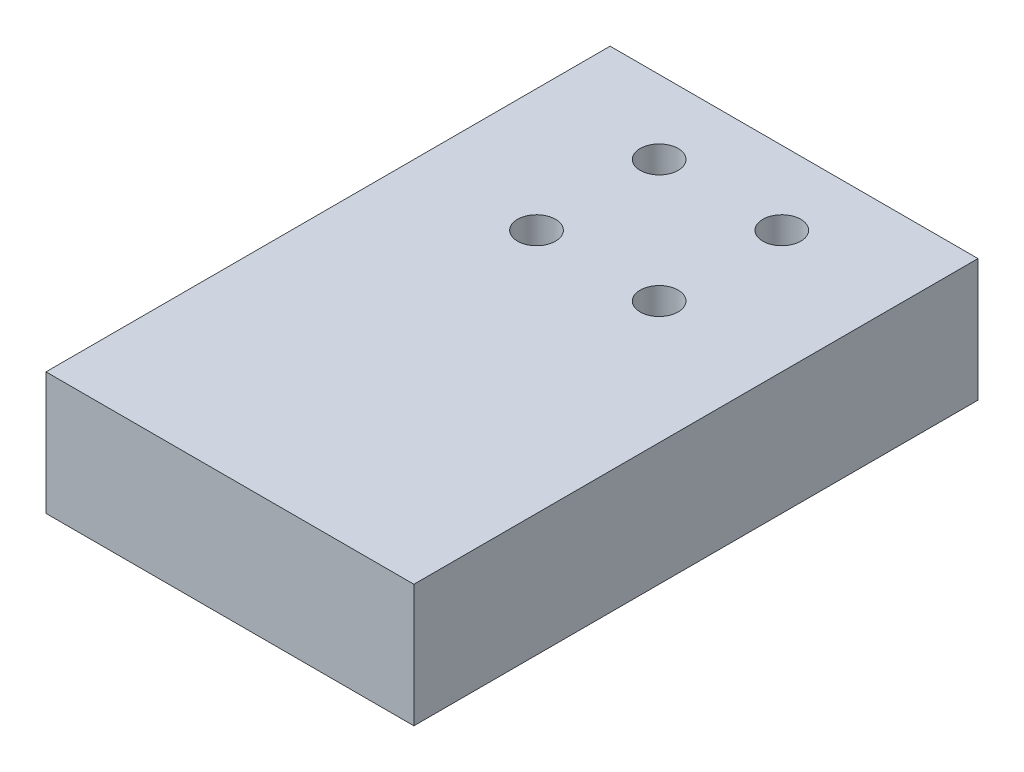
ISO-10303-21;
HEADER;
FILE_DESCRIPTION(('STEP AP214'),'2;1');
FILE_NAME('part.step','',(''),(''),'','','');
FILE_SCHEMA(('AUTOMOTIVE_DESIGN { 1 0 10303 214 1 1 1 1 }'));
ENDSEC;
DATA;
#1=APPLICATION_CONTEXT('core data for automotive mechanical design processes');
#2=APPLICATION_PROTOCOL_DEFINITION('international standard','automotive_design',2000,#1);
#3=PRODUCT_CONTEXT('',#1,'mechanical');
#4=PRODUCT('Part','Part','',(#3));
#5=PRODUCT_RELATED_PRODUCT_CATEGORY('part','',(#4));
#6=PRODUCT_DEFINITION_FORMATION('','',#4);
#7=PRODUCT_DEFINITION_CONTEXT('part definition',#1,'design');
#8=PRODUCT_DEFINITION('design','',#6,#7);
#9=PRODUCT_DEFINITION_SHAPE('','',#8);
#10=(LENGTH_UNIT() NAMED_UNIT(*) SI_UNIT(.MILLI.,.METRE.));
#11=(NAMED_UNIT(*) PLANE_ANGLE_UNIT() SI_UNIT($,.RADIAN.));
#12=(NAMED_UNIT(*) SI_UNIT($,.STERADIAN.) SOLID_ANGLE_UNIT());
#13=UNCERTAINTY_MEASURE_WITH_UNIT(LENGTH_MEASURE(1.E-05),#10,'distance_accuracy_value','');
#14=(GEOMETRIC_REPRESENTATION_CONTEXT(3) GLOBAL_UNCERTAINTY_ASSIGNED_CONTEXT((#13)) GLOBAL_UNIT_ASSIGNED_CONTEXT((#10,
#11,#12)) REPRESENTATION_CONTEXT('',''));
#15=CARTESIAN_POINT('',(0.,0.,0.));
#16=DIRECTION('',(0.,0.,1.));
#17=DIRECTION('',(1.,0.,0.));
#18=AXIS2_PLACEMENT_3D('',#15,#16,#17);
#19=CARTESIAN_POINT('',(5.,30.,1.));
#20=DIRECTION('',(0.,-1.,0.));
#21=DIRECTION('',(0.,0.,-1.));
#22=AXIS2_PLACEMENT_3D('',#19,#20,#21);
#23=CYLINDRICAL_SURFACE('',#22,1.55);
#24=CARTESIAN_POINT('',(5.,10.,1.));
#25=DIRECTION('',(0.,-1.,0.));
#26=DIRECTION('',(0.,0.,-1.));
#27=AXIS2_PLACEMENT_3D('',#24,#25,#26);
#28=CIRCLE('',#27,1.55);
#29=CARTESIAN_POINT('',(5.,10.,-0.55));
#30=VERTEX_POINT('',#29);
#31=EDGE_CURVE('E163',#30,#30,#28,.T.);
#32=ORIENTED_EDGE('',*,*,#31,.F.);
#33=EDGE_LOOP('',(#32));
#34=FACE_BOUND('',#33,.T.);
#35=CARTESIAN_POINT('',(5.,3.,1.));
#36=DIRECTION('',(0.,-1.,0.));
#37=DIRECTION('',(0.,0.,-1.));
#38=AXIS2_PLACEMENT_3D('',#35,#36,#37);
#39=CIRCLE('',#38,1.55);
#40=CARTESIAN_POINT('',(5.,3.,-0.55));
#41=VERTEX_POINT('',#40);
#42=EDGE_CURVE('E152',#41,#41,#39,.F.);
#43=ORIENTED_EDGE('',*,*,#42,.F.);
#44=EDGE_LOOP('',(#43));
#45=FACE_BOUND('',#44,.T.);
#46=ADVANCED_FACE('F45',(#34,#45),#23,.F.);
#47=CARTESIAN_POINT('',(-5.,30.,-9.));
#48=DIRECTION('',(0.,-1.,0.));
#49=DIRECTION('',(0.,0.,-1.));
#50=AXIS2_PLACEMENT_3D('',#47,#48,#49);
#51=CYLINDRICAL_SURFACE('',#50,1.55);
#52=CARTESIAN_POINT('',(-5.,10.,-9.));
#53=DIRECTION('',(0.,-1.,0.));
#54=DIRECTION('',(0.,0.,-1.));
#55=AXIS2_PLACEMENT_3D('',#52,#53,#54);
#56=CIRCLE('',#55,1.55);
#57=CARTESIAN_POINT('',(-5.,10.,-10.55));
#58=VERTEX_POINT('',#57);
#59=EDGE_CURVE('E167',#58,#58,#56,.T.);
#60=ORIENTED_EDGE('',*,*,#59,.F.);
#61=EDGE_LOOP('',(#60));
#62=FACE_BOUND('',#61,.T.);
#63=CARTESIAN_POINT('',(-5.,3.,-9.));
#64=DIRECTION('',(0.,-1.,0.));
#65=DIRECTION('',(0.,0.,-1.));
#66=AXIS2_PLACEMENT_3D('',#63,#64,#65);
#67=CIRCLE('',#66,1.55);
#68=CARTESIAN_POINT('',(-5.,3.,-10.55));
#69=VERTEX_POINT('',#68);
#70=EDGE_CURVE('E137',#69,#69,#67,.F.);
#71=ORIENTED_EDGE('',*,*,#70,.F.);
#72=EDGE_LOOP('',(#71));
#73=FACE_BOUND('',#72,.T.);
#74=ADVANCED_FACE('F199',(#62,#73),#51,.F.);
#75=CARTESIAN_POINT('',(-5.,30.,1.));
#76=DIRECTION('',(0.,-1.,0.));
#77=DIRECTION('',(0.,0.,-1.));
#78=AXIS2_PLACEMENT_3D('',#75,#76,#77);
#79=CYLINDRICAL_SURFACE('',#78,1.55);
#80=CARTESIAN_POINT('',(-5.,10.,1.));
#81=DIRECTION('',(0.,-1.,0.));
#82=DIRECTION('',(0.,0.,-1.));
#83=AXIS2_PLACEMENT_3D('',#80,#81,#82);
#84=CIRCLE('',#83,1.55);
#85=CARTESIAN_POINT('',(-5.,10.,-0.55));
#86=VERTEX_POINT('',#85);
#87=EDGE_CURVE('E171',#86,#86,#84,.T.);
#88=ORIENTED_EDGE('',*,*,#87,.F.);
#89=EDGE_LOOP('',(#88));
#90=FACE_BOUND('',#89,.T.);
#91=CARTESIAN_POINT('',(-5.,3.,1.));
#92=DIRECTION('',(0.,-1.,0.));
#93=DIRECTION('',(0.,0.,-1.));
#94=AXIS2_PLACEMENT_3D('',#91,#92,#93);
#95=CIRCLE('',#94,1.55);
#96=CARTESIAN_POINT('',(-5.,3.,-0.55));
#97=VERTEX_POINT('',#96);
#98=EDGE_CURVE('E49',#97,#97,#95,.F.);
#99=ORIENTED_EDGE('',*,*,#98,.F.);
#100=EDGE_LOOP('',(#99));
#101=FACE_BOUND('',#100,.T.);
#102=ADVANCED_FACE('F196',(#90,#101),#79,.F.);
#103=CARTESIAN_POINT('',(5.,30.,-9.));
#104=DIRECTION('',(0.,-1.,0.));
#105=DIRECTION('',(0.,0.,-1.));
#106=AXIS2_PLACEMENT_3D('',#103,#104,#105);
#107=CYLINDRICAL_SURFACE('',#106,1.55);
#108=CARTESIAN_POINT('',(5.,10.,-9.));
#109=DIRECTION('',(0.,-1.,0.));
#110=DIRECTION('',(0.,0.,-1.));
#111=AXIS2_PLACEMENT_3D('',#108,#109,#110);
#112=CIRCLE('',#111,1.55);
#113=CARTESIAN_POINT('',(5.,10.,-10.55));
#114=VERTEX_POINT('',#113);
#115=EDGE_CURVE('E175',#114,#114,#112,.T.);
#116=ORIENTED_EDGE('',*,*,#115,.F.);
#117=EDGE_LOOP('',(#116));
#118=FACE_BOUND('',#117,.T.);
#119=CARTESIAN_POINT('',(5.,3.,-9.));
#120=DIRECTION('',(0.,-1.,0.));
#121=DIRECTION('',(0.,0.,-1.));
#122=AXIS2_PLACEMENT_3D('',#119,#120,#121);
#123=CIRCLE('',#122,1.55);
#124=CARTESIAN_POINT('',(5.,3.,-10.55));
#125=VERTEX_POINT('',#124);
#126=EDGE_CURVE('E125',#125,#125,#123,.F.);
#127=ORIENTED_EDGE('',*,*,#126,.F.);
#128=EDGE_LOOP('',(#127));
#129=FACE_BOUND('',#128,.T.);
#130=ADVANCED_FACE('F198',(#118,#129),#107,.F.);
#131=CARTESIAN_POINT('',(15.,10.,15.));
#132=DIRECTION('',(-1.,0.,0.));
#133=DIRECTION('',(0.,0.,1.));
#134=AXIS2_PLACEMENT_3D('',#131,#132,#133);
#135=PLANE('',#134);
#136=DIRECTION('',(0.,0.,-1.));
#137=VECTOR('',#136,1.);
#138=CARTESIAN_POINT('',(15.,0.,15.));
#139=LINE('',#138,#137);
#140=CARTESIAN_POINT('',(15.,0.,31.));
#141=VERTEX_POINT('',#140);
#142=CARTESIAN_POINT('',(15.,0.,-15.));
#143=VERTEX_POINT('',#142);
#144=EDGE_CURVE('E103',#141,#143,#139,.T.);
#145=ORIENTED_EDGE('',*,*,#144,.T.);
#146=DIRECTION('',(0.,-1.,0.));
#147=VECTOR('',#146,1.);
#148=CARTESIAN_POINT('',(15.,10.,-15.));
#149=LINE('',#148,#147);
#150=CARTESIAN_POINT('',(15.,10.,-15.));
#151=VERTEX_POINT('',#150);
#152=EDGE_CURVE('E12',#151,#143,#149,.T.);
#153=ORIENTED_EDGE('',*,*,#152,.F.);
#154=DIRECTION('',(0.,0.,-1.));
#155=VECTOR('',#154,1.);
#156=CARTESIAN_POINT('',(15.,10.,15.));
#157=LINE('',#156,#155);
#158=CARTESIAN_POINT('',(15.,10.,31.));
#159=VERTEX_POINT('',#158);
#160=EDGE_CURVE('E97',#159,#151,#157,.T.);
#161=ORIENTED_EDGE('',*,*,#160,.F.);
#162=DIRECTION('',(0.,1.,0.));
#163=VECTOR('',#162,1.);
#164=CARTESIAN_POINT('',(15.,10.,31.));
#165=LINE('',#164,#163);
#166=EDGE_CURVE('E108',#141,#159,#165,.T.);
#167=ORIENTED_EDGE('',*,*,#166,.F.);
#168=EDGE_LOOP('',(#145,#153,#161,#167));
#169=FACE_BOUND('',#168,.T.);
#170=ADVANCED_FACE('F47',(#169),#135,.F.);
#171=CARTESIAN_POINT('',(-15.,10.,-15.));
#172=DIRECTION('',(0.,0.,1.));
#173=DIRECTION('',(1.,0.,0.));
#174=AXIS2_PLACEMENT_3D('',#171,#172,#173);
#175=PLANE('',#174);
#176=DIRECTION('',(-1.,0.,0.));
#177=VECTOR('',#176,1.);
#178=CARTESIAN_POINT('',(-15.,0.,-15.));
#179=LINE('',#178,#177);
#180=CARTESIAN_POINT('',(-15.,0.,-15.));
#181=VERTEX_POINT('',#180);
#182=EDGE_CURVE('E75',#143,#181,#179,.T.);
#183=ORIENTED_EDGE('',*,*,#182,.T.);
#184=DIRECTION('',(0.,-1.,0.));
#185=VECTOR('',#184,1.);
#186=CARTESIAN_POINT('',(-15.,10.,-15.));
#187=LINE('',#186,#185);
#188=CARTESIAN_POINT('',(-15.,10.,-15.));
#189=VERTEX_POINT('',#188);
#190=EDGE_CURVE('E56',#189,#181,#187,.T.);
#191=ORIENTED_EDGE('',*,*,#190,.F.);
#192=DIRECTION('',(-1.,0.,0.));
#193=VECTOR('',#192,1.);
#194=CARTESIAN_POINT('',(-15.,10.,-15.));
#195=LINE('',#194,#193);
#196=EDGE_CURVE('E64',#151,#189,#195,.T.);
#197=ORIENTED_EDGE('',*,*,#196,.F.);
#198=ORIENTED_EDGE('',*,*,#152,.T.);
#199=EDGE_LOOP('',(#183,#191,#197,#198));
#200=FACE_BOUND('',#199,.T.);
#201=ADVANCED_FACE('F228',(#200),#175,.F.);
#202=CARTESIAN_POINT('',(-15.,10.,15.));
#203=DIRECTION('',(1.,0.,0.));
#204=DIRECTION('',(0.,0.,-1.));
#205=AXIS2_PLACEMENT_3D('',#202,#203,#204);
#206=PLANE('',#205);
#207=DIRECTION('',(0.,0.,1.));
#208=VECTOR('',#207,1.);
#209=CARTESIAN_POINT('',(-15.,0.,15.));
#210=LINE('',#209,#208);
#211=CARTESIAN_POINT('',(-15.,0.,31.));
#212=VERTEX_POINT('',#211);
#213=EDGE_CURVE('E91',#181,#212,#210,.T.);
#214=ORIENTED_EDGE('',*,*,#213,.T.);
#215=DIRECTION('',(0.,-1.,0.));
#216=VECTOR('',#215,1.);
#217=CARTESIAN_POINT('',(-15.,10.,31.));
#218=LINE('',#217,#216);
#219=CARTESIAN_POINT('',(-15.,10.,31.));
#220=VERTEX_POINT('',#219);
#221=EDGE_CURVE('E95',#220,#212,#218,.T.);
#222=ORIENTED_EDGE('',*,*,#221,.F.);
#223=DIRECTION('',(0.,0.,1.));
#224=VECTOR('',#223,1.);
#225=CARTESIAN_POINT('',(-15.,10.,15.));
#226=LINE('',#225,#224);
#227=EDGE_CURVE('E79',#189,#220,#226,.T.);
#228=ORIENTED_EDGE('',*,*,#227,.F.);
#229=ORIENTED_EDGE('',*,*,#190,.T.);
#230=EDGE_LOOP('',(#214,#222,#228,#229));
#231=FACE_BOUND('',#230,.T.);
#232=ADVANCED_FACE('F93',(#231),#206,.F.);
#233=CARTESIAN_POINT('',(0.,10.,0.));
#234=DIRECTION('',(0.,-1.,0.));
#235=DIRECTION('',(0.,0.,-1.));
#236=AXIS2_PLACEMENT_3D('',#233,#234,#235);
#237=PLANE('',#236);
#238=ORIENTED_EDGE('',*,*,#115,.T.);
#239=EDGE_LOOP('',(#238));
#240=FACE_BOUND('',#239,.T.);
#241=ORIENTED_EDGE('',*,*,#87,.T.);
#242=EDGE_LOOP('',(#241));
#243=FACE_BOUND('',#242,.T.);
#244=ORIENTED_EDGE('',*,*,#59,.T.);
#245=EDGE_LOOP('',(#244));
#246=FACE_BOUND('',#245,.T.);
#247=ORIENTED_EDGE('',*,*,#31,.T.);
#248=EDGE_LOOP('',(#247));
#249=FACE_BOUND('',#248,.T.);
#250=ORIENTED_EDGE('',*,*,#160,.T.);
#251=ORIENTED_EDGE('',*,*,#196,.T.);
#252=ORIENTED_EDGE('',*,*,#227,.T.);
#253=DIRECTION('',(-1.,0.,0.));
#254=VECTOR('',#253,1.);
#255=CARTESIAN_POINT('',(-15.,10.,31.));
#256=LINE('',#255,#254);
#257=EDGE_CURVE('E111',#159,#220,#256,.T.);
#258=ORIENTED_EDGE('',*,*,#257,.F.);
#259=EDGE_LOOP('',(#250,#251,#252,#258));
#260=FACE_BOUND('',#259,.T.);
#261=ADVANCED_FACE('F219',(#240,#243,#246,#249,#260),#237,.F.);
#262=CARTESIAN_POINT('',(0.,0.,0.));
#263=DIRECTION('',(0.,-1.,0.));
#264=DIRECTION('',(0.,0.,-1.));
#265=AXIS2_PLACEMENT_3D('',#262,#263,#264);
#266=PLANE('',#265);
#267=CARTESIAN_POINT('',(-5.,0.,1.));
#268=DIRECTION('',(0.,-1.,0.));
#269=DIRECTION('',(0.,0.,-1.));
#270=AXIS2_PLACEMENT_3D('',#267,#268,#269);
#271=CIRCLE('',#270,3.5);
#272=CARTESIAN_POINT('',(-5.,0.,-2.5));
#273=VERTEX_POINT('',#272);
#274=EDGE_CURVE('E142',#273,#273,#271,.T.);
#275=ORIENTED_EDGE('',*,*,#274,.F.);
#276=EDGE_LOOP('',(#275));
#277=FACE_BOUND('',#276,.T.);
#278=CARTESIAN_POINT('',(-5.,0.,-9.));
#279=DIRECTION('',(0.,-1.,0.));
#280=DIRECTION('',(0.,0.,-1.));
#281=AXIS2_PLACEMENT_3D('',#278,#279,#280);
#282=CIRCLE('',#281,3.5);
#283=CARTESIAN_POINT('',(-5.,0.,-12.5));
#284=VERTEX_POINT('',#283);
#285=EDGE_CURVE('E130',#284,#284,#282,.T.);
#286=ORIENTED_EDGE('',*,*,#285,.F.);
#287=EDGE_LOOP('',(#286));
#288=FACE_BOUND('',#287,.T.);
#289=CARTESIAN_POINT('',(5.,0.,-9.));
#290=DIRECTION('',(0.,-1.,0.));
#291=DIRECTION('',(0.,0.,-1.));
#292=AXIS2_PLACEMENT_3D('',#289,#290,#291);
#293=CIRCLE('',#292,3.5);
#294=CARTESIAN_POINT('',(5.,0.,-12.5));
#295=VERTEX_POINT('',#294);
#296=EDGE_CURVE('E120',#295,#295,#293,.T.);
#297=ORIENTED_EDGE('',*,*,#296,.F.);
#298=EDGE_LOOP('',(#297));
#299=FACE_BOUND('',#298,.T.);
#300=CARTESIAN_POINT('',(5.,0.,1.));
#301=DIRECTION('',(0.,-1.,0.));
#302=DIRECTION('',(0.,0.,-1.));
#303=AXIS2_PLACEMENT_3D('',#300,#301,#302);
#304=CIRCLE('',#303,3.5);
#305=CARTESIAN_POINT('',(5.,0.,-2.5));
#306=VERTEX_POINT('',#305);
#307=EDGE_CURVE('E124',#306,#306,#304,.T.);
#308=ORIENTED_EDGE('',*,*,#307,.F.);
#309=EDGE_LOOP('',(#308));
#310=FACE_BOUND('',#309,.T.);
#311=ORIENTED_EDGE('',*,*,#144,.F.);
#312=DIRECTION('',(1.,0.,0.));
#313=VECTOR('',#312,1.);
#314=CARTESIAN_POINT('',(-15.,0.,31.));
#315=LINE('',#314,#313);
#316=EDGE_CURVE('E100',#212,#141,#315,.T.);
#317=ORIENTED_EDGE('',*,*,#316,.F.);
#318=ORIENTED_EDGE('',*,*,#213,.F.);
#319=ORIENTED_EDGE('',*,*,#182,.F.);
#320=EDGE_LOOP('',(#311,#317,#318,#319));
#321=FACE_BOUND('',#320,.T.);
#322=ADVANCED_FACE('F101',(#277,#288,#299,#310,#321),#266,.T.);
#323=CARTESIAN_POINT('',(5.,3.,-9.));
#324=DIRECTION('',(0.,-1.,0.));
#325=DIRECTION('',(0.,0.,-1.));
#326=AXIS2_PLACEMENT_3D('',#323,#324,#325);
#327=CYLINDRICAL_SURFACE('',#326,3.5);
#328=CARTESIAN_POINT('',(5.,3.,-9.));
#329=DIRECTION('',(0.,-1.,0.));
#330=DIRECTION('',(0.,0.,-1.));
#331=AXIS2_PLACEMENT_3D('',#328,#329,#330);
#332=CIRCLE('',#331,3.5);
#333=CARTESIAN_POINT('',(5.,3.,-12.5));
#334=VERTEX_POINT('',#333);
#335=EDGE_CURVE('E126',#334,#334,#332,.T.);
#336=ORIENTED_EDGE('',*,*,#335,.F.);
#337=EDGE_LOOP('',(#336));
#338=FACE_BOUND('',#337,.T.);
#339=ORIENTED_EDGE('',*,*,#296,.T.);
#340=EDGE_LOOP('',(#339));
#341=FACE_BOUND('',#340,.T.);
#342=ADVANCED_FACE('F225',(#338,#341),#327,.F.);
#343=CARTESIAN_POINT('',(0.,3.,0.));
#344=DIRECTION('',(0.,-1.,0.));
#345=DIRECTION('',(0.,0.,-1.));
#346=AXIS2_PLACEMENT_3D('',#343,#344,#345);
#347=PLANE('',#346);
#348=ORIENTED_EDGE('',*,*,#126,.T.);
#349=EDGE_LOOP('',(#348));
#350=FACE_BOUND('',#349,.T.);
#351=ORIENTED_EDGE('',*,*,#335,.T.);
#352=EDGE_LOOP('',(#351));
#353=FACE_BOUND('',#352,.T.);
#354=ADVANCED_FACE('F258',(#350,#353),#347,.T.);
#355=CARTESIAN_POINT('',(-5.,3.,1.));
#356=DIRECTION('',(0.,-1.,0.));
#357=DIRECTION('',(0.,0.,-1.));
#358=AXIS2_PLACEMENT_3D('',#355,#356,#357);
#359=PLANE('',#358);
#360=CARTESIAN_POINT('',(-5.,3.,1.));
#361=DIRECTION('',(0.,-1.,0.));
#362=DIRECTION('',(0.,0.,-1.));
#363=AXIS2_PLACEMENT_3D('',#360,#361,#362);
#364=CIRCLE('',#363,3.5);
#365=CARTESIAN_POINT('',(-5.,3.,-2.5));
#366=VERTEX_POINT('',#365);
#367=EDGE_CURVE('E119',#366,#366,#364,.T.);
#368=ORIENTED_EDGE('',*,*,#367,.T.);
#369=EDGE_LOOP('',(#368));
#370=FACE_BOUND('',#369,.T.);
#371=ORIENTED_EDGE('',*,*,#98,.T.);
#372=EDGE_LOOP('',(#371));
#373=FACE_BOUND('',#372,.T.);
#374=ADVANCED_FACE('F194',(#370,#373),#359,.T.);
#375=CARTESIAN_POINT('',(-5.,3.,1.));
#376=DIRECTION('',(0.,-1.,0.));
#377=DIRECTION('',(0.,0.,-1.));
#378=AXIS2_PLACEMENT_3D('',#375,#376,#377);
#379=CYLINDRICAL_SURFACE('',#378,3.5);
#380=ORIENTED_EDGE('',*,*,#367,.F.);
#381=EDGE_LOOP('',(#380));
#382=FACE_BOUND('',#381,.T.);
#383=ORIENTED_EDGE('',*,*,#274,.T.);
#384=EDGE_LOOP('',(#383));
#385=FACE_BOUND('',#384,.T.);
#386=ADVANCED_FACE('F278',(#382,#385),#379,.F.);
#387=CARTESIAN_POINT('',(-5.,3.,-9.));
#388=DIRECTION('',(0.,-1.,0.));
#389=DIRECTION('',(0.,0.,-1.));
#390=AXIS2_PLACEMENT_3D('',#387,#388,#389);
#391=CYLINDRICAL_SURFACE('',#390,3.5);
#392=CARTESIAN_POINT('',(-5.,3.,-9.));
#393=DIRECTION('',(0.,-1.,0.));
#394=DIRECTION('',(0.,0.,-1.));
#395=AXIS2_PLACEMENT_3D('',#392,#393,#394);
#396=CIRCLE('',#395,3.5);
#397=CARTESIAN_POINT('',(-5.,3.,-12.5));
#398=VERTEX_POINT('',#397);
#399=EDGE_CURVE('E138',#398,#398,#396,.T.);
#400=ORIENTED_EDGE('',*,*,#399,.F.);
#401=EDGE_LOOP('',(#400));
#402=FACE_BOUND('',#401,.T.);
#403=ORIENTED_EDGE('',*,*,#285,.T.);
#404=EDGE_LOOP('',(#403));
#405=FACE_BOUND('',#404,.T.);
#406=ADVANCED_FACE('F288',(#402,#405),#391,.F.);
#407=CARTESIAN_POINT('',(0.,3.,0.));
#408=DIRECTION('',(0.,-1.,0.));
#409=DIRECTION('',(0.,0.,-1.));
#410=AXIS2_PLACEMENT_3D('',#407,#408,#409);
#411=PLANE('',#410);
#412=ORIENTED_EDGE('',*,*,#70,.T.);
#413=EDGE_LOOP('',(#412));
#414=FACE_BOUND('',#413,.T.);
#415=ORIENTED_EDGE('',*,*,#399,.T.);
#416=EDGE_LOOP('',(#415));
#417=FACE_BOUND('',#416,.T.);
#418=ADVANCED_FACE('F298',(#414,#417),#411,.T.);
#419=CARTESIAN_POINT('',(5.,3.,1.));
#420=DIRECTION('',(0.,-1.,0.));
#421=DIRECTION('',(0.,0.,-1.));
#422=AXIS2_PLACEMENT_3D('',#419,#420,#421);
#423=CYLINDRICAL_SURFACE('',#422,3.5);
#424=CARTESIAN_POINT('',(5.,3.,1.));
#425=DIRECTION('',(0.,-1.,0.));
#426=DIRECTION('',(0.,0.,-1.));
#427=AXIS2_PLACEMENT_3D('',#424,#425,#426);
#428=CIRCLE('',#427,3.5);
#429=CARTESIAN_POINT('',(5.,3.,-2.5));
#430=VERTEX_POINT('',#429);
#431=EDGE_CURVE('E156',#430,#430,#428,.T.);
#432=ORIENTED_EDGE('',*,*,#431,.F.);
#433=EDGE_LOOP('',(#432));
#434=FACE_BOUND('',#433,.T.);
#435=ORIENTED_EDGE('',*,*,#307,.T.);
#436=EDGE_LOOP('',(#435));
#437=FACE_BOUND('',#436,.T.);
#438=ADVANCED_FACE('F308',(#434,#437),#423,.F.);
#439=CARTESIAN_POINT('',(0.,3.,0.));
#440=DIRECTION('',(0.,-1.,0.));
#441=DIRECTION('',(0.,0.,-1.));
#442=AXIS2_PLACEMENT_3D('',#439,#440,#441);
#443=PLANE('',#442);
#444=ORIENTED_EDGE('',*,*,#42,.T.);
#445=EDGE_LOOP('',(#444));
#446=FACE_BOUND('',#445,.T.);
#447=ORIENTED_EDGE('',*,*,#431,.T.);
#448=EDGE_LOOP('',(#447));
#449=FACE_BOUND('',#448,.T.);
#450=ADVANCED_FACE('F317',(#446,#449),#443,.T.);
#451=CARTESIAN_POINT('',(0.,0.,31.));
#452=DIRECTION('',(0.,0.,1.));
#453=DIRECTION('',(1.,0.,0.));
#454=AXIS2_PLACEMENT_3D('',#451,#452,#453);
#455=PLANE('',#454);
#456=ORIENTED_EDGE('',*,*,#221,.T.);
#457=ORIENTED_EDGE('',*,*,#316,.T.);
#458=ORIENTED_EDGE('',*,*,#166,.T.);
#459=ORIENTED_EDGE('',*,*,#257,.T.);
#460=EDGE_LOOP('',(#456,#457,#458,#459));
#461=FACE_BOUND('',#460,.T.);
#462=ADVANCED_FACE('F110',(#461),#455,.T.);
#463=CLOSED_SHELL('',(#46,#74,#102,#130,#170,#201,#232,#261,#322,#342,#354,#374,#386,#406,#418,
#438,#450,#462));
#464=MANIFOLD_SOLID_BREP('B2',#463);
#465=ADVANCED_BREP_SHAPE_REPRESENTATION('',(#18,#464),#14);
#466=SHAPE_DEFINITION_REPRESENTATION(#9,#465);
ENDSEC;
END-ISO-10303-21;
